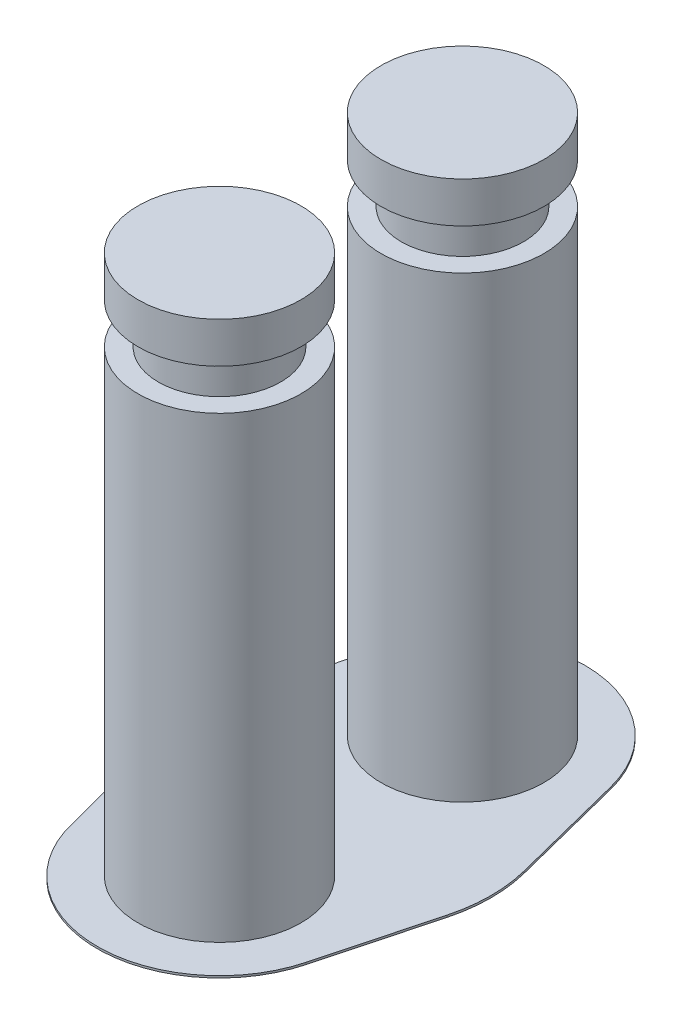
ISO-10303-21;
HEADER;
FILE_DESCRIPTION(('STEP AP214'),'2;1');
FILE_NAME('part.step','',(''),(''),'','','');
FILE_SCHEMA(('AUTOMOTIVE_DESIGN { 1 0 10303 214 1 1 1 1 }'));
ENDSEC;
DATA;
#1=APPLICATION_CONTEXT('core data for automotive mechanical design processes');
#2=APPLICATION_PROTOCOL_DEFINITION('international standard','automotive_design',2000,#1);
#3=PRODUCT_CONTEXT('',#1,'mechanical');
#4=PRODUCT('Part','Part','',(#3));
#5=PRODUCT_RELATED_PRODUCT_CATEGORY('part','',(#4));
#6=PRODUCT_DEFINITION_FORMATION('','',#4);
#7=PRODUCT_DEFINITION_CONTEXT('part definition',#1,'design');
#8=PRODUCT_DEFINITION('design','',#6,#7);
#9=PRODUCT_DEFINITION_SHAPE('','',#8);
#10=(LENGTH_UNIT() NAMED_UNIT(*) SI_UNIT(.MILLI.,.METRE.));
#11=(NAMED_UNIT(*) PLANE_ANGLE_UNIT() SI_UNIT($,.RADIAN.));
#12=(NAMED_UNIT(*) SI_UNIT($,.STERADIAN.) SOLID_ANGLE_UNIT());
#13=UNCERTAINTY_MEASURE_WITH_UNIT(LENGTH_MEASURE(1.E-05),#10,'distance_accuracy_value','');
#14=(GEOMETRIC_REPRESENTATION_CONTEXT(3) GLOBAL_UNCERTAINTY_ASSIGNED_CONTEXT((#13)) GLOBAL_UNIT_ASSIGNED_CONTEXT((#10,
#11,#12)) REPRESENTATION_CONTEXT('',''));
#15=CARTESIAN_POINT('',(0.,0.,0.));
#16=DIRECTION('',(0.,0.,1.));
#17=DIRECTION('',(1.,0.,0.));
#18=AXIS2_PLACEMENT_3D('',#15,#16,#17);
#19=CARTESIAN_POINT('',(5.64864999999999,0.100000000000001,-6.08973027497629));
#20=DIRECTION('',(0.,1.,0.));
#21=DIRECTION('',(0.,0.,1.));
#22=AXIS2_PLACEMENT_3D('',#19,#20,#21);
#23=PLANE('',#22);
#24=CARTESIAN_POINT('',(3.75,0.100000000000001,-6.08973027497629));
#25=DIRECTION('',(0.,1.,0.));
#26=DIRECTION('',(0.,0.,1.));
#27=AXIS2_PLACEMENT_3D('',#24,#25,#26);
#28=CIRCLE('',#27,1.89864999999999);
#29=CARTESIAN_POINT('',(3.75,0.100000000000001,-4.1910802749763));
#30=VERTEX_POINT('',#29);
#31=EDGE_CURVE('E340',#30,#30,#28,.T.);
#32=ORIENTED_EDGE('',*,*,#31,.F.);
#33=EDGE_LOOP('',(#32));
#34=FACE_BOUND('',#33,.T.);
#35=CARTESIAN_POINT('',(3.75,0.0999999999999993,-6.08973027497629));
#36=DIRECTION('',(0.,-1.,0.));
#37=DIRECTION('',(0.,0.,-1.));
#38=AXIS2_PLACEMENT_3D('',#35,#36,#37);
#39=CIRCLE('',#38,1.35254999999999);
#40=CARTESIAN_POINT('',(3.75,0.0999999999999993,-7.44228027497628));
#41=VERTEX_POINT('',#40);
#42=EDGE_CURVE('E346',#41,#41,#39,.T.);
#43=ORIENTED_EDGE('',*,*,#42,.F.);
#44=EDGE_LOOP('',(#43));
#45=FACE_BOUND('',#44,.T.);
#46=ADVANCED_FACE('F39',(#34,#45),#23,.F.);
#47=CARTESIAN_POINT('',(10.7914021707681,0.1,-2.7425994459952));
#48=DIRECTION('',(-0.969189489495146,0.,0.246316328025849));
#49=DIRECTION('',(0.246316328025849,0.,0.969189489495146));
#50=AXIS2_PLACEMENT_3D('',#47,#48,#49);
#51=PLANE('',#50);
#52=DIRECTION('',(-0.246316328025849,0.,-0.969189489495146));
#53=VECTOR('',#52,1.);
#54=CARTESIAN_POINT('',(10.7914021707681,0.,-2.7425994459952));
#55=LINE('',#54,#53);
#56=CARTESIAN_POINT('',(11.0189211712136,0.,-1.84737246019386));
#57=VERTEX_POINT('',#56);
#58=CARTESIAN_POINT('',(9.56513693697088,0.,-7.56762824313138));
#59=VERTEX_POINT('',#58);
#60=EDGE_CURVE('E141',#57,#59,#55,.T.);
#61=ORIENTED_EDGE('',*,*,#60,.T.);
#62=DIRECTION('',(0.,-1.,0.));
#63=VECTOR('',#62,1.);
#64=CARTESIAN_POINT('',(9.56513693697088,0.1,-7.56762824313138));
#65=LINE('',#64,#63);
#66=CARTESIAN_POINT('',(9.56513693697088,0.1,-7.56762824313138));
#67=VERTEX_POINT('',#66);
#68=EDGE_CURVE('E43',#67,#59,#65,.T.);
#69=ORIENTED_EDGE('',*,*,#68,.F.);
#70=DIRECTION('',(-0.246316328025849,0.,-0.969189489495146));
#71=VECTOR('',#70,1.);
#72=CARTESIAN_POINT('',(10.7914021707681,0.1,-2.7425994459952));
#73=LINE('',#72,#71);
#74=CARTESIAN_POINT('',(11.0189211712136,0.1,-1.84737246019386));
#75=VERTEX_POINT('',#74);
#76=EDGE_CURVE('E157',#75,#67,#73,.T.);
#77=ORIENTED_EDGE('',*,*,#76,.F.);
#78=DIRECTION('',(0.,-1.,0.));
#79=VECTOR('',#78,1.);
#80=CARTESIAN_POINT('',(11.0189211712136,0.1,-1.84737246019386));
#81=LINE('',#80,#79);
#82=EDGE_CURVE('E137',#75,#57,#81,.T.);
#83=ORIENTED_EDGE('',*,*,#82,.T.);
#84=EDGE_LOOP('',(#61,#69,#77,#83));
#85=FACE_BOUND('',#84,.T.);
#86=ADVANCED_FACE('F41',(#85),#51,.F.);
#87=CARTESIAN_POINT('',(3.75,0.1,-6.08973027497629));
#88=DIRECTION('',(0.,-1.,0.));
#89=DIRECTION('',(0.,0.,-1.));
#90=AXIS2_PLACEMENT_3D('',#87,#88,#89);
#91=CYLINDRICAL_SURFACE('',#90,6.);
#92=CARTESIAN_POINT('',(3.75,0.,-6.08973027497629));
#93=DIRECTION('',(0.,1.,0.));
#94=DIRECTION('',(0.,0.,1.));
#95=AXIS2_PLACEMENT_3D('',#92,#93,#94);
#96=CIRCLE('',#95,6.);
#97=CARTESIAN_POINT('',(-2.06513693697088,0.,-7.56762824313138));
#98=VERTEX_POINT('',#97);
#99=EDGE_CURVE('E144',#59,#98,#96,.T.);
#100=ORIENTED_EDGE('',*,*,#99,.T.);
#101=DIRECTION('',(0.,-1.,0.));
#102=VECTOR('',#101,1.);
#103=CARTESIAN_POINT('',(-2.06513693697088,0.1,-7.56762824313138));
#104=LINE('',#103,#102);
#105=CARTESIAN_POINT('',(-2.06513693697088,0.1,-7.56762824313138));
#106=VERTEX_POINT('',#105);
#107=EDGE_CURVE('E166',#106,#98,#104,.T.);
#108=ORIENTED_EDGE('',*,*,#107,.F.);
#109=CARTESIAN_POINT('',(3.75,0.1,-6.08973027497629));
#110=DIRECTION('',(0.,1.,0.));
#111=DIRECTION('',(0.,0.,1.));
#112=AXIS2_PLACEMENT_3D('',#109,#110,#111);
#113=CIRCLE('',#112,6.);
#114=EDGE_CURVE('E99',#67,#106,#113,.T.);
#115=ORIENTED_EDGE('',*,*,#114,.F.);
#116=ORIENTED_EDGE('',*,*,#68,.T.);
#117=EDGE_LOOP('',(#100,#108,#115,#116));
#118=FACE_BOUND('',#117,.T.);
#119=ADVANCED_FACE('F226',(#118),#91,.T.);
#120=CARTESIAN_POINT('',(-3.74644017165911,0.1,-0.95214547439252));
#121=DIRECTION('',(0.969189489495147,0.,0.246316328025848));
#122=DIRECTION('',(0.246316328025848,0.,-0.969189489495147));
#123=AXIS2_PLACEMENT_3D('',#120,#121,#122);
#124=PLANE('',#123);
#125=DIRECTION('',(-0.246316328025848,0.,0.969189489495147));
#126=VECTOR('',#125,1.);
#127=CARTESIAN_POINT('',(-3.74644017165911,0.,-0.95214547439252));
#128=LINE('',#127,#126);
#129=CARTESIAN_POINT('',(-3.5189211712136,0.,-1.84737246019386));
#130=VERTEX_POINT('',#129);
#131=EDGE_CURVE('E147',#98,#130,#128,.T.);
#132=ORIENTED_EDGE('',*,*,#131,.T.);
#133=DIRECTION('',(0.,-1.,0.));
#134=VECTOR('',#133,1.);
#135=CARTESIAN_POINT('',(-3.5189211712136,0.1,-1.84737246019386));
#136=LINE('',#135,#134);
#137=CARTESIAN_POINT('',(-3.5189211712136,0.1,-1.84737246019386));
#138=VERTEX_POINT('',#137);
#139=EDGE_CURVE('E164',#138,#130,#136,.T.);
#140=ORIENTED_EDGE('',*,*,#139,.F.);
#141=DIRECTION('',(-0.246316328025848,0.,0.969189489495147));
#142=VECTOR('',#141,1.);
#143=CARTESIAN_POINT('',(-3.74644017165911,0.1,-0.95214547439252));
#144=LINE('',#143,#142);
#145=EDGE_CURVE('E192',#106,#138,#144,.T.);
#146=ORIENTED_EDGE('',*,*,#145,.F.);
#147=ORIENTED_EDGE('',*,*,#107,.T.);
#148=EDGE_LOOP('',(#132,#140,#146,#147));
#149=FACE_BOUND('',#148,.T.);
#150=ADVANCED_FACE('F493',(#149),#124,.F.);
#151=CARTESIAN_POINT('',(3.75,0.1,0.));
#152=DIRECTION('',(0.,-1.,0.));
#153=DIRECTION('',(0.,0.,-1.));
#154=AXIS2_PLACEMENT_3D('',#151,#152,#153);
#155=CYLINDRICAL_SURFACE('',#154,7.5);
#156=CARTESIAN_POINT('',(3.75,0.,0.));
#157=DIRECTION('',(0.,1.,0.));
#158=DIRECTION('',(0.,0.,1.));
#159=AXIS2_PLACEMENT_3D('',#156,#157,#158);
#160=CIRCLE('',#159,7.5);
#161=CARTESIAN_POINT('',(-3.49342660554137,0.,1.94493470587972));
#162=VERTEX_POINT('',#161);
#163=EDGE_CURVE('E149',#130,#162,#160,.T.);
#164=ORIENTED_EDGE('',*,*,#163,.T.);
#165=DIRECTION('',(0.,-1.,0.));
#166=VECTOR('',#165,1.);
#167=CARTESIAN_POINT('',(-3.49342660554137,0.1,1.94493470587972));
#168=LINE('',#167,#166);
#169=CARTESIAN_POINT('',(-3.49342660554137,0.1,1.94493470587972));
#170=VERTEX_POINT('',#169);
#171=EDGE_CURVE('E161',#170,#162,#168,.T.);
#172=ORIENTED_EDGE('',*,*,#171,.F.);
#173=CARTESIAN_POINT('',(3.75,0.1,0.));
#174=DIRECTION('',(0.,1.,0.));
#175=DIRECTION('',(0.,0.,1.));
#176=AXIS2_PLACEMENT_3D('',#173,#174,#175);
#177=CIRCLE('',#176,7.5);
#178=EDGE_CURVE('E194',#138,#170,#177,.T.);
#179=ORIENTED_EDGE('',*,*,#178,.F.);
#180=ORIENTED_EDGE('',*,*,#139,.T.);
#181=EDGE_LOOP('',(#164,#172,#179,#180));
#182=FACE_BOUND('',#181,.T.);
#183=ADVANCED_FACE('F199',(#182),#155,.T.);
#184=CARTESIAN_POINT('',(-3.7456113395504,0.1,1.00573525290572));
#185=DIRECTION('',(0.965790214072183,0.,-0.259324627450629));
#186=DIRECTION('',(-0.259324627450629,0.,-0.965790214072183));
#187=AXIS2_PLACEMENT_3D('',#184,#185,#186);
#188=PLANE('',#187);
#189=DIRECTION('',(0.259324627450629,0.,0.965790214072183));
#190=VECTOR('',#189,1.);
#191=CARTESIAN_POINT('',(-3.7456113395504,0.,1.00573525290572));
#192=LINE('',#191,#190);
#193=CARTESIAN_POINT('',(-1.92167348288411,0.,7.79853912333431));
#194=VERTEX_POINT('',#193);
#195=EDGE_CURVE('E151',#162,#194,#192,.T.);
#196=ORIENTED_EDGE('',*,*,#195,.T.);
#197=DIRECTION('',(0.,-1.,0.));
#198=VECTOR('',#197,1.);
#199=CARTESIAN_POINT('',(-1.92167348288411,0.1,7.79853912333431));
#200=LINE('',#199,#198);
#201=CARTESIAN_POINT('',(-1.92167348288411,0.1,7.79853912333431));
#202=VERTEX_POINT('',#201);
#203=EDGE_CURVE('E133',#202,#194,#200,.T.);
#204=ORIENTED_EDGE('',*,*,#203,.F.);
#205=DIRECTION('',(0.259324627450629,0.,0.965790214072183));
#206=VECTOR('',#205,1.);
#207=CARTESIAN_POINT('',(-3.7456113395504,0.1,1.00573525290572));
#208=LINE('',#207,#206);
#209=EDGE_CURVE('E120',#170,#202,#208,.T.);
#210=ORIENTED_EDGE('',*,*,#209,.F.);
#211=ORIENTED_EDGE('',*,*,#171,.T.);
#212=EDGE_LOOP('',(#196,#204,#210,#211));
#213=FACE_BOUND('',#212,.T.);
#214=ADVANCED_FACE('F203',(#213),#188,.F.);
#215=CARTESIAN_POINT('',(3.75,0.1,5.84095900912463));
#216=DIRECTION('',(0.,-1.,0.));
#217=DIRECTION('',(0.,0.,-1.));
#218=AXIS2_PLACEMENT_3D('',#215,#216,#217);
#219=CYLINDRICAL_SURFACE('',#218,6.);
#220=CARTESIAN_POINT('',(3.75,0.,5.84095900912463));
#221=DIRECTION('',(0.,1.,0.));
#222=DIRECTION('',(0.,0.,1.));
#223=AXIS2_PLACEMENT_3D('',#220,#221,#222);
#224=CIRCLE('',#223,6.);
#225=CARTESIAN_POINT('',(9.54877601505246,0.,7.38180187173338));
#226=VERTEX_POINT('',#225);
#227=EDGE_CURVE('E129',#194,#226,#224,.T.);
#228=ORIENTED_EDGE('',*,*,#227,.T.);
#229=DIRECTION('',(0.,-1.,0.));
#230=VECTOR('',#229,1.);
#231=CARTESIAN_POINT('',(9.54877601505246,0.1,7.38180187173338));
#232=LINE('',#231,#230);
#233=CARTESIAN_POINT('',(9.54877601505246,0.1,7.38180187173338));
#234=VERTEX_POINT('',#233);
#235=EDGE_CURVE('E126',#234,#226,#232,.T.);
#236=ORIENTED_EDGE('',*,*,#235,.F.);
#237=CARTESIAN_POINT('',(3.75,0.1,5.84095900912463));
#238=DIRECTION('',(0.,1.,0.));
#239=DIRECTION('',(0.,0.,1.));
#240=AXIS2_PLACEMENT_3D('',#237,#238,#239);
#241=CIRCLE('',#240,6.);
#242=EDGE_CURVE('E114',#202,#234,#241,.T.);
#243=ORIENTED_EDGE('',*,*,#242,.F.);
#244=ORIENTED_EDGE('',*,*,#203,.T.);
#245=EDGE_LOOP('',(#228,#236,#243,#244));
#246=FACE_BOUND('',#245,.T.);
#247=ADVANCED_FACE('F127',(#246),#219,.T.);
#248=CARTESIAN_POINT('',(10.7511578597268,0.1,2.8567830193714));
#249=DIRECTION('',(0.96646266917541,0.,0.256807143768126));
#250=DIRECTION('',(0.256807143768126,0.,-0.96646266917541));
#251=AXIS2_PLACEMENT_3D('',#248,#249,#250);
#252=PLANE('',#251);
#253=DIRECTION('',(-0.256807143768126,0.,0.96646266917541));
#254=VECTOR('',#253,1.);
#255=CARTESIAN_POINT('',(10.7511578597268,0.,2.8567830193714));
#256=LINE('',#255,#254);
#257=CARTESIAN_POINT('',(10.9984700188156,0.,1.92605357826094));
#258=VERTEX_POINT('',#257);
#259=EDGE_CURVE('E154',#258,#226,#256,.T.);
#260=ORIENTED_EDGE('',*,*,#259,.F.);
#261=DIRECTION('',(0.,-1.,0.));
#262=VECTOR('',#261,1.);
#263=CARTESIAN_POINT('',(10.9984700188156,0.1,1.92605357826094));
#264=LINE('',#263,#262);
#265=CARTESIAN_POINT('',(10.9984700188156,0.1,1.92605357826094));
#266=VERTEX_POINT('',#265);
#267=EDGE_CURVE('E87',#266,#258,#264,.T.);
#268=ORIENTED_EDGE('',*,*,#267,.F.);
#269=DIRECTION('',(-0.256807143768126,0.,0.96646266917541));
#270=VECTOR('',#269,1.);
#271=CARTESIAN_POINT('',(10.7511578597268,0.1,2.8567830193714));
#272=LINE('',#271,#270);
#273=EDGE_CURVE('E118',#266,#234,#272,.T.);
#274=ORIENTED_EDGE('',*,*,#273,.T.);
#275=ORIENTED_EDGE('',*,*,#235,.T.);
#276=EDGE_LOOP('',(#260,#268,#274,#275));
#277=FACE_BOUND('',#276,.T.);
#278=ADVANCED_FACE('F135',(#277),#252,.T.);
#279=CARTESIAN_POINT('',(3.75,0.1,0.));
#280=DIRECTION('',(0.,-1.,0.));
#281=DIRECTION('',(0.,0.,-1.));
#282=AXIS2_PLACEMENT_3D('',#279,#280,#281);
#283=CYLINDRICAL_SURFACE('',#282,7.5);
#284=CARTESIAN_POINT('',(3.75,0.,0.));
#285=DIRECTION('',(0.,1.,0.));
#286=DIRECTION('',(0.,0.,1.));
#287=AXIS2_PLACEMENT_3D('',#284,#285,#286);
#288=CIRCLE('',#287,7.5);
#289=EDGE_CURVE('E90',#258,#57,#288,.T.);
#290=ORIENTED_EDGE('',*,*,#289,.T.);
#291=ORIENTED_EDGE('',*,*,#82,.F.);
#292=CARTESIAN_POINT('',(3.75,0.1,0.));
#293=DIRECTION('',(0.,1.,0.));
#294=DIRECTION('',(0.,0.,1.));
#295=AXIS2_PLACEMENT_3D('',#292,#293,#294);
#296=CIRCLE('',#295,7.5);
#297=EDGE_CURVE('E58',#266,#75,#296,.T.);
#298=ORIENTED_EDGE('',*,*,#297,.F.);
#299=ORIENTED_EDGE('',*,*,#267,.T.);
#300=EDGE_LOOP('',(#290,#291,#298,#299));
#301=FACE_BOUND('',#300,.T.);
#302=ADVANCED_FACE('F209',(#301),#283,.T.);
#303=CARTESIAN_POINT('',(0.,0.1,0.));
#304=DIRECTION('',(0.,1.,0.));
#305=DIRECTION('',(0.,0.,1.));
#306=AXIS2_PLACEMENT_3D('',#303,#304,#305);
#307=PLANE('',#306);
#308=CARTESIAN_POINT('',(3.75,0.1,-6.08973027497629));
#309=DIRECTION('',(0.,1.,0.));
#310=DIRECTION('',(0.,0.,1.));
#311=AXIS2_PLACEMENT_3D('',#308,#309,#310);
#312=CIRCLE('',#311,4.);
#313=CARTESIAN_POINT('',(3.75,0.100000000000003,-10.0897302749763));
#314=VERTEX_POINT('',#313);
#315=EDGE_CURVE('E183',#314,#314,#312,.T.);
#316=ORIENTED_EDGE('',*,*,#315,.F.);
#317=EDGE_LOOP('',(#316));
#318=FACE_BOUND('',#317,.T.);
#319=CARTESIAN_POINT('',(3.75,0.1,5.84095900912463));
#320=DIRECTION('',(0.,1.,0.));
#321=DIRECTION('',(0.,0.,1.));
#322=AXIS2_PLACEMENT_3D('',#319,#320,#321);
#323=CIRCLE('',#322,4.);
#324=CARTESIAN_POINT('',(3.75,0.100000000000003,1.84095900912463));
#325=VERTEX_POINT('',#324);
#326=EDGE_CURVE('E182',#325,#325,#323,.T.);
#327=ORIENTED_EDGE('',*,*,#326,.F.);
#328=EDGE_LOOP('',(#327));
#329=FACE_BOUND('',#328,.T.);
#330=ORIENTED_EDGE('',*,*,#76,.T.);
#331=ORIENTED_EDGE('',*,*,#114,.T.);
#332=ORIENTED_EDGE('',*,*,#145,.T.);
#333=ORIENTED_EDGE('',*,*,#178,.T.);
#334=ORIENTED_EDGE('',*,*,#209,.T.);
#335=ORIENTED_EDGE('',*,*,#242,.T.);
#336=ORIENTED_EDGE('',*,*,#273,.F.);
#337=ORIENTED_EDGE('',*,*,#297,.T.);
#338=EDGE_LOOP('',(#330,#331,#332,#333,#334,#335,#336,#337));
#339=FACE_BOUND('',#338,.T.);
#340=ADVANCED_FACE('F116',(#318,#329,#339),#307,.T.);
#341=CARTESIAN_POINT('',(0.,0.,0.));
#342=DIRECTION('',(0.,1.,0.));
#343=DIRECTION('',(0.,0.,1.));
#344=AXIS2_PLACEMENT_3D('',#341,#342,#343);
#345=PLANE('',#344);
#346=CARTESIAN_POINT('',(3.75,0.,-6.08973027497629));
#347=DIRECTION('',(0.,1.,0.));
#348=DIRECTION('',(0.,0.,1.));
#349=AXIS2_PLACEMENT_3D('',#346,#347,#348);
#350=CIRCLE('',#349,1.89865);
#351=CARTESIAN_POINT('',(3.75,0.,-4.19108027497629));
#352=VERTEX_POINT('',#351);
#353=EDGE_CURVE('E295',#352,#352,#350,.T.);
#354=ORIENTED_EDGE('',*,*,#353,.T.);
#355=EDGE_LOOP('',(#354));
#356=FACE_BOUND('',#355,.T.);
#357=CARTESIAN_POINT('',(3.75,0.,5.84095900912463));
#358=DIRECTION('',(0.,1.,0.));
#359=DIRECTION('',(0.,0.,1.));
#360=AXIS2_PLACEMENT_3D('',#357,#358,#359);
#361=CIRCLE('',#360,1.89865);
#362=CARTESIAN_POINT('',(3.75,0.,7.73960900912463));
#363=VERTEX_POINT('',#362);
#364=EDGE_CURVE('E298',#363,#363,#361,.T.);
#365=ORIENTED_EDGE('',*,*,#364,.T.);
#366=EDGE_LOOP('',(#365));
#367=FACE_BOUND('',#366,.T.);
#368=ORIENTED_EDGE('',*,*,#60,.F.);
#369=ORIENTED_EDGE('',*,*,#289,.F.);
#370=ORIENTED_EDGE('',*,*,#259,.T.);
#371=ORIENTED_EDGE('',*,*,#227,.F.);
#372=ORIENTED_EDGE('',*,*,#195,.F.);
#373=ORIENTED_EDGE('',*,*,#163,.F.);
#374=ORIENTED_EDGE('',*,*,#131,.F.);
#375=ORIENTED_EDGE('',*,*,#99,.F.);
#376=EDGE_LOOP('',(#368,#369,#370,#371,#372,#373,#374,#375));
#377=FACE_BOUND('',#376,.T.);
#378=ADVANCED_FACE('F206',(#356,#367,#377),#345,.F.);
#379=CARTESIAN_POINT('',(3.75,22.6,5.84095900912463));
#380=DIRECTION('',(0.,-1.,0.));
#381=DIRECTION('',(0.,0.,-1.));
#382=AXIS2_PLACEMENT_3D('',#379,#380,#381);
#383=CYLINDRICAL_SURFACE('',#382,4.);
#384=CARTESIAN_POINT('',(3.75,22.6,5.84095900912463));
#385=DIRECTION('',(0.,1.,0.));
#386=DIRECTION('',(0.,0.,1.));
#387=AXIS2_PLACEMENT_3D('',#384,#385,#386);
#388=CIRCLE('',#387,4.);
#389=CARTESIAN_POINT('',(3.75,22.6,1.84095900912463));
#390=VERTEX_POINT('',#389);
#391=EDGE_CURVE('E145',#390,#390,#388,.T.);
#392=CARTESIAN_POINT('',(3.75,22.6,1.84095900912463));
#393=CARTESIAN_POINT('',(3.75,22.365625,1.84095900912463));
#394=CARTESIAN_POINT('',(3.75,22.13125,1.84095900912463));
#395=CARTESIAN_POINT('',(3.75,21.6625,1.84095900912463));
#396=CARTESIAN_POINT('',(3.75,21.428125,1.84095900912463));
#397=CARTESIAN_POINT('',(3.75,20.959375,1.84095900912463));
#398=CARTESIAN_POINT('',(3.75,20.725,1.84095900912463));
#399=CARTESIAN_POINT('',(3.75,20.25625,1.84095900912463));
#400=CARTESIAN_POINT('',(3.75,20.021875,1.84095900912463));
#401=CARTESIAN_POINT('',(3.75,19.553125,1.84095900912463));
#402=CARTESIAN_POINT('',(3.75,19.31875,1.84095900912463));
#403=CARTESIAN_POINT('',(3.75,18.85,1.84095900912463));
#404=CARTESIAN_POINT('',(3.75,18.615625,1.84095900912463));
#405=CARTESIAN_POINT('',(3.75,18.146875,1.84095900912463));
#406=CARTESIAN_POINT('',(3.75,17.9125,1.84095900912463));
#407=CARTESIAN_POINT('',(3.75,17.44375,1.84095900912463));
#408=CARTESIAN_POINT('',(3.75,17.209375,1.84095900912463));
#409=CARTESIAN_POINT('',(3.75,16.740625,1.84095900912463));
#410=CARTESIAN_POINT('',(3.75,16.50625,1.84095900912463));
#411=CARTESIAN_POINT('',(3.75,16.0375,1.84095900912463));
#412=CARTESIAN_POINT('',(3.75,15.803125,1.84095900912463));
#413=CARTESIAN_POINT('',(3.75,15.334375,1.84095900912463));
#414=CARTESIAN_POINT('',(3.75,15.1,1.84095900912463));
#415=CARTESIAN_POINT('',(3.75,14.63125,1.84095900912463));
#416=CARTESIAN_POINT('',(3.75,14.396875,1.84095900912463));
#417=CARTESIAN_POINT('',(3.75,13.928125,1.84095900912463));
#418=CARTESIAN_POINT('',(3.75,13.69375,1.84095900912463));
#419=CARTESIAN_POINT('',(3.75,13.225,1.84095900912463));
#420=CARTESIAN_POINT('',(3.75,12.990625,1.84095900912463));
#421=CARTESIAN_POINT('',(3.75,12.521875,1.84095900912463));
#422=CARTESIAN_POINT('',(3.75,12.2875,1.84095900912463));
#423=CARTESIAN_POINT('',(3.75,11.81875,1.84095900912463));
#424=CARTESIAN_POINT('',(3.75,11.584375,1.84095900912463));
#425=CARTESIAN_POINT('',(3.75,11.115625,1.84095900912463));
#426=CARTESIAN_POINT('',(3.75,10.88125,1.84095900912463));
#427=CARTESIAN_POINT('',(3.75,10.4125,1.84095900912463));
#428=CARTESIAN_POINT('',(3.75,10.178125,1.84095900912463));
#429=CARTESIAN_POINT('',(3.75,9.709375,1.84095900912463));
#430=CARTESIAN_POINT('',(3.75,9.475,1.84095900912463));
#431=CARTESIAN_POINT('',(3.75,9.00625,1.84095900912463));
#432=CARTESIAN_POINT('',(3.75,8.771875,1.84095900912463));
#433=CARTESIAN_POINT('',(3.75,8.303125,1.84095900912463));
#434=CARTESIAN_POINT('',(3.75,8.06875,1.84095900912463));
#435=CARTESIAN_POINT('',(3.75,7.6,1.84095900912463));
#436=CARTESIAN_POINT('',(3.75,7.365625,1.84095900912463));
#437=CARTESIAN_POINT('',(3.75,6.896875,1.84095900912463));
#438=CARTESIAN_POINT('',(3.75,6.6625,1.84095900912463));
#439=CARTESIAN_POINT('',(3.75,6.19375,1.84095900912463));
#440=CARTESIAN_POINT('',(3.75,5.959375,1.84095900912463));
#441=CARTESIAN_POINT('',(3.75,5.490625,1.84095900912463));
#442=CARTESIAN_POINT('',(3.75,5.25625,1.84095900912463));
#443=CARTESIAN_POINT('',(3.75,4.7875,1.84095900912463));
#444=CARTESIAN_POINT('',(3.75,4.553125,1.84095900912463));
#445=CARTESIAN_POINT('',(3.75,4.084375,1.84095900912463));
#446=CARTESIAN_POINT('',(3.75,3.85,1.84095900912463));
#447=CARTESIAN_POINT('',(3.75,3.38125,1.84095900912463));
#448=CARTESIAN_POINT('',(3.75,3.146875,1.84095900912463));
#449=CARTESIAN_POINT('',(3.75,2.678125,1.84095900912463));
#450=CARTESIAN_POINT('',(3.75,2.44375,1.84095900912463));
#451=CARTESIAN_POINT('',(3.75,1.975,1.84095900912463));
#452=CARTESIAN_POINT('',(3.75,1.740625,1.84095900912463));
#453=CARTESIAN_POINT('',(3.75,1.271875,1.84095900912463));
#454=CARTESIAN_POINT('',(3.75,1.0375,1.84095900912463));
#455=CARTESIAN_POINT('',(3.75,0.568750000000002,1.84095900912463));
#456=CARTESIAN_POINT('',(3.75,0.334375000000003,1.84095900912463));
#457=CARTESIAN_POINT('',(3.75,0.100000000000003,1.84095900912463));
#458=B_SPLINE_CURVE_WITH_KNOTS('',3,(#392,#393,#394,#395,#396,#397,#398,#399,#400,#401,#402,
#403,#404,#405,#406,#407,#408,#409,#410,#411,#412,#413,#414,#415,#416,#417,#418,#419,#420,#421,
#422,#423,#424,#425,#426,#427,#428,#429,#430,#431,#432,#433,#434,#435,#436,#437,#438,#439,#440,
#441,#442,#443,#444,#445,#446,#447,#448,#449,#450,#451,#452,#453,#454,#455,#456,#457),
.UNSPECIFIED.,.F.,.F.,(4,2,2,2,2,2,2,2,2,2,2,2,2,2,2,2,2,2,2,2,2,2,2,2,2,2,2,2,2,2,2,2,4),(0.,
0.703125000000002,1.40625,2.109375,2.8125,3.515625,4.21875,4.921875,5.625,6.328125,7.03125,
7.734375,8.4375,9.140625,9.84375,10.546875,11.25,11.953125,12.65625,13.359375,14.0625,14.765625,
15.46875,16.171875,16.875,17.578125,18.28125,18.984375,19.6875,20.390625,21.09375,21.796875,
22.5),.UNSPECIFIED.);
#459=EDGE_CURVE('BSEAM284',#390,#325,#458,.T.);
#460=ORIENTED_EDGE('',*,*,#391,.F.);
#461=ORIENTED_EDGE('',*,*,#326,.T.);
#462=ORIENTED_EDGE('',*,*,#459,.T.);
#463=ORIENTED_EDGE('',*,*,#459,.F.);
#464=EDGE_LOOP('',(#460,#462,#461,#463));
#465=FACE_BOUND('',#464,.T.);
#466=ADVANCED_FACE('F284',(#465),#383,.T.);
#467=CARTESIAN_POINT('',(3.75,22.6,5.84095900912463));
#468=DIRECTION('',(0.,1.,0.));
#469=DIRECTION('',(0.,0.,1.));
#470=AXIS2_PLACEMENT_3D('',#467,#468,#469);
#471=PLANE('',#470);
#472=CARTESIAN_POINT('',(3.75,22.6,5.84095900912463));
#473=DIRECTION('',(0.,1.,0.));
#474=DIRECTION('',(0.,0.,1.));
#475=AXIS2_PLACEMENT_3D('',#472,#473,#474);
#476=CIRCLE('',#475,3.);
#477=CARTESIAN_POINT('',(3.75,22.6,8.84095900912463));
#478=VERTEX_POINT('',#477);
#479=EDGE_CURVE('E49',#478,#478,#476,.T.);
#480=ORIENTED_EDGE('',*,*,#479,.F.);
#481=EDGE_LOOP('',(#480));
#482=FACE_BOUND('',#481,.T.);
#483=ORIENTED_EDGE('',*,*,#391,.T.);
#484=EDGE_LOOP('',(#483));
#485=FACE_BOUND('',#484,.T.);
#486=ADVANCED_FACE('F280',(#482,#485),#471,.T.);
#487=CARTESIAN_POINT('',(3.75,22.6,-6.08973027497629));
#488=DIRECTION('',(0.,-1.,0.));
#489=DIRECTION('',(0.,0.,-1.));
#490=AXIS2_PLACEMENT_3D('',#487,#488,#489);
#491=CYLINDRICAL_SURFACE('',#490,4.);
#492=CARTESIAN_POINT('',(3.75,22.6,-6.08973027497629));
#493=DIRECTION('',(0.,1.,0.));
#494=DIRECTION('',(0.,0.,1.));
#495=AXIS2_PLACEMENT_3D('',#492,#493,#494);
#496=CIRCLE('',#495,4.);
#497=CARTESIAN_POINT('',(3.75,22.6,-10.0897302749763));
#498=VERTEX_POINT('',#497);
#499=EDGE_CURVE('E179',#498,#498,#496,.T.);
#500=CARTESIAN_POINT('',(3.75,22.6,-10.0897302749763));
#501=CARTESIAN_POINT('',(3.75,22.365625,-10.0897302749763));
#502=CARTESIAN_POINT('',(3.75,22.13125,-10.0897302749763));
#503=CARTESIAN_POINT('',(3.75,21.6625,-10.0897302749763));
#504=CARTESIAN_POINT('',(3.75,21.428125,-10.0897302749763));
#505=CARTESIAN_POINT('',(3.75,20.959375,-10.0897302749763));
#506=CARTESIAN_POINT('',(3.75,20.725,-10.0897302749763));
#507=CARTESIAN_POINT('',(3.75,20.25625,-10.0897302749763));
#508=CARTESIAN_POINT('',(3.75,20.021875,-10.0897302749763));
#509=CARTESIAN_POINT('',(3.75,19.553125,-10.0897302749763));
#510=CARTESIAN_POINT('',(3.75,19.31875,-10.0897302749763));
#511=CARTESIAN_POINT('',(3.75,18.85,-10.0897302749763));
#512=CARTESIAN_POINT('',(3.75,18.615625,-10.0897302749763));
#513=CARTESIAN_POINT('',(3.75,18.146875,-10.0897302749763));
#514=CARTESIAN_POINT('',(3.75,17.9125,-10.0897302749763));
#515=CARTESIAN_POINT('',(3.75,17.44375,-10.0897302749763));
#516=CARTESIAN_POINT('',(3.75,17.209375,-10.0897302749763));
#517=CARTESIAN_POINT('',(3.75,16.740625,-10.0897302749763));
#518=CARTESIAN_POINT('',(3.75,16.50625,-10.0897302749763));
#519=CARTESIAN_POINT('',(3.75,16.0375,-10.0897302749763));
#520=CARTESIAN_POINT('',(3.75,15.803125,-10.0897302749763));
#521=CARTESIAN_POINT('',(3.75,15.334375,-10.0897302749763));
#522=CARTESIAN_POINT('',(3.75,15.1,-10.0897302749763));
#523=CARTESIAN_POINT('',(3.75,14.63125,-10.0897302749763));
#524=CARTESIAN_POINT('',(3.75,14.396875,-10.0897302749763));
#525=CARTESIAN_POINT('',(3.75,13.928125,-10.0897302749763));
#526=CARTESIAN_POINT('',(3.75,13.69375,-10.0897302749763));
#527=CARTESIAN_POINT('',(3.75,13.225,-10.0897302749763));
#528=CARTESIAN_POINT('',(3.75,12.990625,-10.0897302749763));
#529=CARTESIAN_POINT('',(3.75,12.521875,-10.0897302749763));
#530=CARTESIAN_POINT('',(3.75,12.2875,-10.0897302749763));
#531=CARTESIAN_POINT('',(3.75,11.81875,-10.0897302749763));
#532=CARTESIAN_POINT('',(3.75,11.584375,-10.0897302749763));
#533=CARTESIAN_POINT('',(3.75,11.115625,-10.0897302749763));
#534=CARTESIAN_POINT('',(3.75,10.88125,-10.0897302749763));
#535=CARTESIAN_POINT('',(3.75,10.4125,-10.0897302749763));
#536=CARTESIAN_POINT('',(3.75,10.178125,-10.0897302749763));
#537=CARTESIAN_POINT('',(3.75,9.709375,-10.0897302749763));
#538=CARTESIAN_POINT('',(3.75,9.475,-10.0897302749763));
#539=CARTESIAN_POINT('',(3.75,9.00625,-10.0897302749763));
#540=CARTESIAN_POINT('',(3.75,8.771875,-10.0897302749763));
#541=CARTESIAN_POINT('',(3.75,8.303125,-10.0897302749763));
#542=CARTESIAN_POINT('',(3.75,8.06875,-10.0897302749763));
#543=CARTESIAN_POINT('',(3.75,7.6,-10.0897302749763));
#544=CARTESIAN_POINT('',(3.75,7.365625,-10.0897302749763));
#545=CARTESIAN_POINT('',(3.75,6.896875,-10.0897302749763));
#546=CARTESIAN_POINT('',(3.75,6.6625,-10.0897302749763));
#547=CARTESIAN_POINT('',(3.75,6.19375,-10.0897302749763));
#548=CARTESIAN_POINT('',(3.75,5.959375,-10.0897302749763));
#549=CARTESIAN_POINT('',(3.75,5.490625,-10.0897302749763));
#550=CARTESIAN_POINT('',(3.75,5.25625,-10.0897302749763));
#551=CARTESIAN_POINT('',(3.75,4.7875,-10.0897302749763));
#552=CARTESIAN_POINT('',(3.75,4.553125,-10.0897302749763));
#553=CARTESIAN_POINT('',(3.75,4.084375,-10.0897302749763));
#554=CARTESIAN_POINT('',(3.75,3.85,-10.0897302749763));
#555=CARTESIAN_POINT('',(3.75,3.38125,-10.0897302749763));
#556=CARTESIAN_POINT('',(3.75,3.146875,-10.0897302749763));
#557=CARTESIAN_POINT('',(3.75,2.678125,-10.0897302749763));
#558=CARTESIAN_POINT('',(3.75,2.44375,-10.0897302749763));
#559=CARTESIAN_POINT('',(3.75,1.975,-10.0897302749763));
#560=CARTESIAN_POINT('',(3.75,1.740625,-10.0897302749763));
#561=CARTESIAN_POINT('',(3.75,1.271875,-10.0897302749763));
#562=CARTESIAN_POINT('',(3.75,1.0375,-10.0897302749763));
#563=CARTESIAN_POINT('',(3.75,0.568750000000002,-10.0897302749763));
#564=CARTESIAN_POINT('',(3.75,0.334375000000003,-10.0897302749763));
#565=CARTESIAN_POINT('',(3.75,0.100000000000003,-10.0897302749763));
#566=B_SPLINE_CURVE_WITH_KNOTS('',3,(#500,#501,#502,#503,#504,#505,#506,#507,#508,#509,#510,
#511,#512,#513,#514,#515,#516,#517,#518,#519,#520,#521,#522,#523,#524,#525,#526,#527,#528,#529,
#530,#531,#532,#533,#534,#535,#536,#537,#538,#539,#540,#541,#542,#543,#544,#545,#546,#547,#548,
#549,#550,#551,#552,#553,#554,#555,#556,#557,#558,#559,#560,#561,#562,#563,#564,#565),
.UNSPECIFIED.,.F.,.F.,(4,2,2,2,2,2,2,2,2,2,2,2,2,2,2,2,2,2,2,2,2,2,2,2,2,2,2,2,2,2,2,2,4),(0.,
0.703125000000002,1.40625,2.109375,2.8125,3.515625,4.21875,4.921875,5.625,6.328125,7.03125,
7.734375,8.4375,9.140625,9.84375,10.546875,11.25,11.953125,12.65625,13.359375,14.0625,14.765625,
15.46875,16.171875,16.875,17.578125,18.28125,18.984375,19.6875,20.390625,21.09375,21.796875,
22.5),.UNSPECIFIED.);
#567=EDGE_CURVE('BSEAM276',#498,#314,#566,.T.);
#568=ORIENTED_EDGE('',*,*,#499,.F.);
#569=ORIENTED_EDGE('',*,*,#315,.T.);
#570=ORIENTED_EDGE('',*,*,#567,.T.);
#571=ORIENTED_EDGE('',*,*,#567,.F.);
#572=EDGE_LOOP('',(#568,#570,#569,#571));
#573=FACE_BOUND('',#572,.T.);
#574=ADVANCED_FACE('F276',(#573),#491,.T.);
#575=CARTESIAN_POINT('',(3.75,22.6,-6.08973027497629));
#576=DIRECTION('',(0.,1.,0.));
#577=DIRECTION('',(0.,0.,1.));
#578=AXIS2_PLACEMENT_3D('',#575,#576,#577);
#579=PLANE('',#578);
#580=CARTESIAN_POINT('',(3.75,22.6,-6.08973027497629));
#581=DIRECTION('',(0.,1.,0.));
#582=DIRECTION('',(0.,0.,1.));
#583=AXIS2_PLACEMENT_3D('',#580,#581,#582);
#584=CIRCLE('',#583,3.);
#585=CARTESIAN_POINT('',(3.75,22.6,-3.08973027497629));
#586=VERTEX_POINT('',#585);
#587=EDGE_CURVE('E11',#586,#586,#584,.T.);
#588=ORIENTED_EDGE('',*,*,#587,.F.);
#589=EDGE_LOOP('',(#588));
#590=FACE_BOUND('',#589,.T.);
#591=ORIENTED_EDGE('',*,*,#499,.T.);
#592=EDGE_LOOP('',(#591));
#593=FACE_BOUND('',#592,.T.);
#594=ADVANCED_FACE('F272',(#590,#593),#579,.T.);
#595=CARTESIAN_POINT('',(3.75,24.6,5.84095900912463));
#596=DIRECTION('',(0.,-1.,0.));
#597=DIRECTION('',(0.,0.,-1.));
#598=AXIS2_PLACEMENT_3D('',#595,#596,#597);
#599=CYLINDRICAL_SURFACE('',#598,3.);
#600=CARTESIAN_POINT('',(3.75,24.6,5.84095900912463));
#601=DIRECTION('',(0.,1.,0.));
#602=DIRECTION('',(0.,0.,1.));
#603=AXIS2_PLACEMENT_3D('',#600,#601,#602);
#604=CIRCLE('',#603,3.);
#605=CARTESIAN_POINT('',(3.75,24.6,8.84095900912463));
#606=VERTEX_POINT('',#605);
#607=EDGE_CURVE('E178',#606,#606,#604,.T.);
#608=ORIENTED_EDGE('',*,*,#607,.F.);
#609=EDGE_LOOP('',(#608));
#610=FACE_BOUND('',#609,.T.);
#611=ORIENTED_EDGE('',*,*,#479,.T.);
#612=EDGE_LOOP('',(#611));
#613=FACE_BOUND('',#612,.T.);
#614=ADVANCED_FACE('F268',(#610,#613),#599,.T.);
#615=CARTESIAN_POINT('',(3.75,24.6,-6.08973027497629));
#616=DIRECTION('',(0.,-1.,0.));
#617=DIRECTION('',(0.,0.,-1.));
#618=AXIS2_PLACEMENT_3D('',#615,#616,#617);
#619=CYLINDRICAL_SURFACE('',#618,3.);
#620=CARTESIAN_POINT('',(3.75,24.6,-6.08973027497629));
#621=DIRECTION('',(0.,1.,0.));
#622=DIRECTION('',(0.,0.,1.));
#623=AXIS2_PLACEMENT_3D('',#620,#621,#622);
#624=CIRCLE('',#623,3.);
#625=CARTESIAN_POINT('',(3.75,24.6,-3.08973027497629));
#626=VERTEX_POINT('',#625);
#627=EDGE_CURVE('E315',#626,#626,#624,.T.);
#628=ORIENTED_EDGE('',*,*,#627,.F.);
#629=EDGE_LOOP('',(#628));
#630=FACE_BOUND('',#629,.T.);
#631=ORIENTED_EDGE('',*,*,#587,.T.);
#632=EDGE_LOOP('',(#631));
#633=FACE_BOUND('',#632,.T.);
#634=ADVANCED_FACE('F264',(#630,#633),#619,.T.);
#635=CARTESIAN_POINT('',(3.75,26.6,5.84095900912463));
#636=DIRECTION('',(0.,-1.,0.));
#637=DIRECTION('',(0.,0.,-1.));
#638=AXIS2_PLACEMENT_3D('',#635,#636,#637);
#639=CYLINDRICAL_SURFACE('',#638,4.);
#640=CARTESIAN_POINT('',(3.75,26.6,5.84095900912463));
#641=DIRECTION('',(0.,1.,0.));
#642=DIRECTION('',(0.,0.,1.));
#643=AXIS2_PLACEMENT_3D('',#640,#641,#642);
#644=CIRCLE('',#643,4.);
#645=CARTESIAN_POINT('',(3.75,26.6,9.84095900912463));
#646=VERTEX_POINT('',#645);
#647=EDGE_CURVE('E312',#646,#646,#644,.T.);
#648=ORIENTED_EDGE('',*,*,#647,.F.);
#649=EDGE_LOOP('',(#648));
#650=FACE_BOUND('',#649,.T.);
#651=CARTESIAN_POINT('',(3.75,24.6,5.84095900912463));
#652=DIRECTION('',(0.,1.,0.));
#653=DIRECTION('',(0.,0.,1.));
#654=AXIS2_PLACEMENT_3D('',#651,#652,#653);
#655=CIRCLE('',#654,4.);
#656=CARTESIAN_POINT('',(3.75,24.6,9.84095900912463));
#657=VERTEX_POINT('',#656);
#658=EDGE_CURVE('E310',#657,#657,#655,.T.);
#659=ORIENTED_EDGE('',*,*,#658,.T.);
#660=EDGE_LOOP('',(#659));
#661=FACE_BOUND('',#660,.T.);
#662=ADVANCED_FACE('F257',(#650,#661),#639,.T.);
#663=CARTESIAN_POINT('',(3.75,26.6,5.84095900912463));
#664=DIRECTION('',(0.,1.,0.));
#665=DIRECTION('',(0.,0.,1.));
#666=AXIS2_PLACEMENT_3D('',#663,#664,#665);
#667=PLANE('',#666);
#668=ORIENTED_EDGE('',*,*,#647,.T.);
#669=EDGE_LOOP('',(#668));
#670=FACE_BOUND('',#669,.T.);
#671=ADVANCED_FACE('F254',(#670),#667,.T.);
#672=CARTESIAN_POINT('',(3.75,24.6,5.84095900912463));
#673=DIRECTION('',(0.,1.,0.));
#674=DIRECTION('',(0.,0.,1.));
#675=AXIS2_PLACEMENT_3D('',#672,#673,#674);
#676=PLANE('',#675);
#677=ORIENTED_EDGE('',*,*,#607,.T.);
#678=EDGE_LOOP('',(#677));
#679=FACE_BOUND('',#678,.T.);
#680=ORIENTED_EDGE('',*,*,#658,.F.);
#681=EDGE_LOOP('',(#680));
#682=FACE_BOUND('',#681,.T.);
#683=ADVANCED_FACE('F252',(#679,#682),#676,.F.);
#684=CARTESIAN_POINT('',(3.75,26.6,-6.08973027497629));
#685=DIRECTION('',(0.,-1.,0.));
#686=DIRECTION('',(0.,0.,-1.));
#687=AXIS2_PLACEMENT_3D('',#684,#685,#686);
#688=CYLINDRICAL_SURFACE('',#687,4.);
#689=CARTESIAN_POINT('',(3.75,26.6,-6.08973027497629));
#690=DIRECTION('',(0.,1.,0.));
#691=DIRECTION('',(0.,0.,1.));
#692=AXIS2_PLACEMENT_3D('',#689,#690,#691);
#693=CIRCLE('',#692,4.);
#694=CARTESIAN_POINT('',(3.75,26.6,-2.08973027497629));
#695=VERTEX_POINT('',#694);
#696=EDGE_CURVE('E303',#695,#695,#693,.T.);
#697=ORIENTED_EDGE('',*,*,#696,.F.);
#698=EDGE_LOOP('',(#697));
#699=FACE_BOUND('',#698,.T.);
#700=CARTESIAN_POINT('',(3.75,24.6,-6.08973027497629));
#701=DIRECTION('',(0.,1.,0.));
#702=DIRECTION('',(0.,0.,1.));
#703=AXIS2_PLACEMENT_3D('',#700,#701,#702);
#704=CIRCLE('',#703,4.);
#705=CARTESIAN_POINT('',(3.75,24.6,-2.08973027497629));
#706=VERTEX_POINT('',#705);
#707=EDGE_CURVE('E299',#706,#706,#704,.T.);
#708=ORIENTED_EDGE('',*,*,#707,.T.);
#709=EDGE_LOOP('',(#708));
#710=FACE_BOUND('',#709,.T.);
#711=ADVANCED_FACE('F245',(#699,#710),#688,.T.);
#712=CARTESIAN_POINT('',(3.75,26.6,-6.08973027497629));
#713=DIRECTION('',(0.,1.,0.));
#714=DIRECTION('',(0.,0.,1.));
#715=AXIS2_PLACEMENT_3D('',#712,#713,#714);
#716=PLANE('',#715);
#717=ORIENTED_EDGE('',*,*,#696,.T.);
#718=EDGE_LOOP('',(#717));
#719=FACE_BOUND('',#718,.T.);
#720=ADVANCED_FACE('F242',(#719),#716,.T.);
#721=CARTESIAN_POINT('',(3.75,24.6,-6.08973027497629));
#722=DIRECTION('',(0.,1.,0.));
#723=DIRECTION('',(0.,0.,1.));
#724=AXIS2_PLACEMENT_3D('',#721,#722,#723);
#725=PLANE('',#724);
#726=ORIENTED_EDGE('',*,*,#627,.T.);
#727=EDGE_LOOP('',(#726));
#728=FACE_BOUND('',#727,.T.);
#729=ORIENTED_EDGE('',*,*,#707,.F.);
#730=EDGE_LOOP('',(#729));
#731=FACE_BOUND('',#730,.T.);
#732=ADVANCED_FACE('F240',(#728,#731),#725,.F.);
#733=CARTESIAN_POINT('',(5.64864999999999,0.100000000000001,5.84095900912463));
#734=DIRECTION('',(0.,1.,0.));
#735=DIRECTION('',(0.,0.,1.));
#736=AXIS2_PLACEMENT_3D('',#733,#734,#735);
#737=PLANE('',#736);
#738=CARTESIAN_POINT('',(3.75,0.0999999999999993,5.84095900912463));
#739=DIRECTION('',(0.,-1.,0.));
#740=DIRECTION('',(0.,0.,-1.));
#741=AXIS2_PLACEMENT_3D('',#738,#739,#740);
#742=CIRCLE('',#741,1.35254999999999);
#743=CARTESIAN_POINT('',(3.75,0.0999999999999993,4.48840900912464));
#744=VERTEX_POINT('',#743);
#745=EDGE_CURVE('E352',#744,#744,#742,.T.);
#746=ORIENTED_EDGE('',*,*,#745,.F.);
#747=EDGE_LOOP('',(#746));
#748=FACE_BOUND('',#747,.T.);
#749=CARTESIAN_POINT('',(3.75,0.100000000000001,5.84095900912463));
#750=DIRECTION('',(0.,1.,0.));
#751=DIRECTION('',(0.,0.,1.));
#752=AXIS2_PLACEMENT_3D('',#749,#750,#751);
#753=CIRCLE('',#752,1.89864999999999);
#754=CARTESIAN_POINT('',(3.75,0.100000000000001,7.73960900912462));
#755=VERTEX_POINT('',#754);
#756=EDGE_CURVE('E300',#755,#755,#753,.T.);
#757=ORIENTED_EDGE('',*,*,#756,.F.);
#758=EDGE_LOOP('',(#757));
#759=FACE_BOUND('',#758,.T.);
#760=ADVANCED_FACE('F236',(#748,#759),#737,.F.);
#761=CARTESIAN_POINT('',(3.75,0.1,5.84095900912463));
#762=DIRECTION('',(0.,1.,0.));
#763=DIRECTION('',(0.,0.,1.));
#764=AXIS2_PLACEMENT_3D('',#761,#762,#763);
#765=CYLINDRICAL_SURFACE('',#764,1.89864999999999);
#766=ORIENTED_EDGE('',*,*,#364,.F.);
#767=EDGE_LOOP('',(#766));
#768=FACE_BOUND('',#767,.T.);
#769=ORIENTED_EDGE('',*,*,#756,.T.);
#770=EDGE_LOOP('',(#769));
#771=FACE_BOUND('',#770,.T.);
#772=ADVANCED_FACE('F233',(#768,#771),#765,.F.);
#773=CARTESIAN_POINT('',(3.75,0.1,-6.08973027497629));
#774=DIRECTION('',(0.,1.,0.));
#775=DIRECTION('',(0.,0.,1.));
#776=AXIS2_PLACEMENT_3D('',#773,#774,#775);
#777=CYLINDRICAL_SURFACE('',#776,1.89864999999999);
#778=ORIENTED_EDGE('',*,*,#353,.F.);
#779=EDGE_LOOP('',(#778));
#780=FACE_BOUND('',#779,.T.);
#781=ORIENTED_EDGE('',*,*,#31,.T.);
#782=EDGE_LOOP('',(#781));
#783=FACE_BOUND('',#782,.T.);
#784=ADVANCED_FACE('F231',(#780,#783),#777,.F.);
#785=CARTESIAN_POINT('',(3.75,9.49,-6.08973027497629));
#786=DIRECTION('',(0.,-1.,0.));
#787=DIRECTION('',(0.,0.,-1.));
#788=AXIS2_PLACEMENT_3D('',#785,#786,#787);
#789=CONICAL_SURFACE('',#788,1.35254999999999,1.02974425867665);
#790=CARTESIAN_POINT('',(3.75,10.3026940302657,-6.08973027497629));
#791=VERTEX_POINT('',#790);
#792=VERTEX_LOOP('',#791);
#793=FACE_BOUND('',#792,.T.);
#794=CARTESIAN_POINT('',(3.75,9.49,-6.08973027497629));
#795=DIRECTION('',(0.,-1.,0.));
#796=DIRECTION('',(0.,0.,-1.));
#797=AXIS2_PLACEMENT_3D('',#794,#795,#796);
#798=CIRCLE('',#797,1.35254999999999);
#799=CARTESIAN_POINT('',(3.75,9.49,-7.44228027497628));
#800=VERTEX_POINT('',#799);
#801=EDGE_CURVE('E343',#800,#800,#798,.T.);
#802=ORIENTED_EDGE('',*,*,#801,.T.);
#803=EDGE_LOOP('',(#802));
#804=FACE_BOUND('',#803,.T.);
#805=ADVANCED_FACE('F373',(#793,#804),#789,.F.);
#806=CARTESIAN_POINT('',(3.75,0.100000000000001,-6.08973027497629));
#807=DIRECTION('',(0.,-1.,0.));
#808=DIRECTION('',(0.,0.,-1.));
#809=AXIS2_PLACEMENT_3D('',#806,#807,#808);
#810=CYLINDRICAL_SURFACE('',#809,1.35254999999999);
#811=ORIENTED_EDGE('',*,*,#801,.F.);
#812=EDGE_LOOP('',(#811));
#813=FACE_BOUND('',#812,.T.);
#814=ORIENTED_EDGE('',*,*,#42,.T.);
#815=EDGE_LOOP('',(#814));
#816=FACE_BOUND('',#815,.T.);
#817=ADVANCED_FACE('F367',(#813,#816),#810,.F.);
#818=CARTESIAN_POINT('',(3.75,9.49,5.84095900912463));
#819=DIRECTION('',(0.,-1.,0.));
#820=DIRECTION('',(0.,0.,-1.));
#821=AXIS2_PLACEMENT_3D('',#818,#819,#820);
#822=CONICAL_SURFACE('',#821,1.35254999999999,1.02974425867665);
#823=CARTESIAN_POINT('',(3.75,10.3026940302657,5.84095900912463));
#824=VERTEX_POINT('',#823);
#825=VERTEX_LOOP('',#824);
#826=FACE_BOUND('',#825,.T.);
#827=CARTESIAN_POINT('',(3.75,9.49,5.84095900912463));
#828=DIRECTION('',(0.,-1.,0.));
#829=DIRECTION('',(0.,0.,-1.));
#830=AXIS2_PLACEMENT_3D('',#827,#828,#829);
#831=CIRCLE('',#830,1.35254999999999);
#832=CARTESIAN_POINT('',(3.75,9.49,4.48840900912464));
#833=VERTEX_POINT('',#832);
#834=EDGE_CURVE('E349',#833,#833,#831,.T.);
#835=ORIENTED_EDGE('',*,*,#834,.T.);
#836=EDGE_LOOP('',(#835));
#837=FACE_BOUND('',#836,.T.);
#838=ADVANCED_FACE('F361',(#826,#837),#822,.F.);
#839=CARTESIAN_POINT('',(3.75,0.100000000000001,5.84095900912463));
#840=DIRECTION('',(0.,-1.,0.));
#841=DIRECTION('',(0.,0.,-1.));
#842=AXIS2_PLACEMENT_3D('',#839,#840,#841);
#843=CYLINDRICAL_SURFACE('',#842,1.35254999999999);
#844=ORIENTED_EDGE('',*,*,#834,.F.);
#845=EDGE_LOOP('',(#844));
#846=FACE_BOUND('',#845,.T.);
#847=ORIENTED_EDGE('',*,*,#745,.T.);
#848=EDGE_LOOP('',(#847));
#849=FACE_BOUND('',#848,.T.);
#850=ADVANCED_FACE('F356',(#846,#849),#843,.F.);
#851=CLOSED_SHELL('',(#46,#86,#119,#150,#183,#214,#247,#278,#302,#340,#378,#466,#486,#574,#594,
#614,#634,#662,#671,#683,#711,#720,#732,#760,#772,#784,#805,#817,#838,#850));
#852=MANIFOLD_SOLID_BREP('B2',#851);
#853=ADVANCED_BREP_SHAPE_REPRESENTATION('',(#18,#852),#14);
#854=SHAPE_DEFINITION_REPRESENTATION(#9,#853);
ENDSEC;
END-ISO-10303-21;
